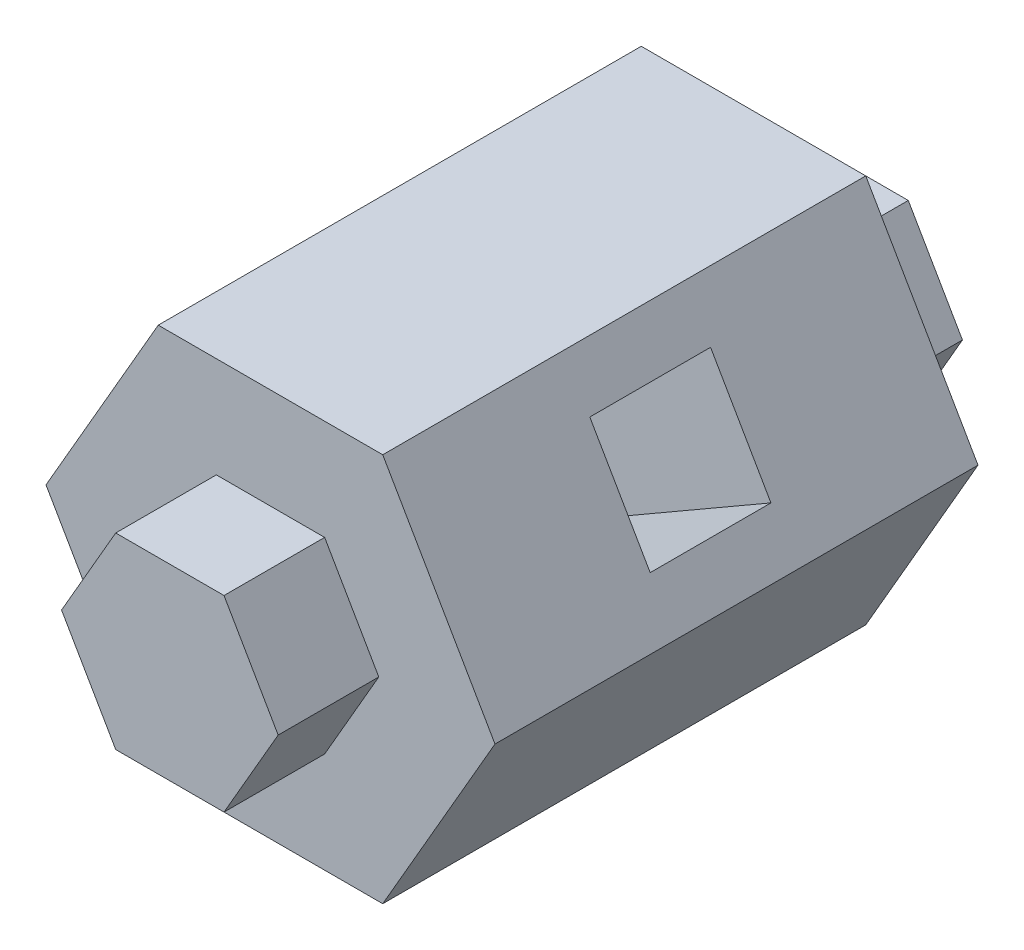
ISO-10303-21;
HEADER;
FILE_DESCRIPTION(('STEP AP214'),'2;1');
FILE_NAME('part.step','',(''),(''),'','','');
FILE_SCHEMA(('AUTOMOTIVE_DESIGN { 1 0 10303 214 1 1 1 1 }'));
ENDSEC;
DATA;
#1=APPLICATION_CONTEXT('core data for automotive mechanical design processes');
#2=APPLICATION_PROTOCOL_DEFINITION('international standard','automotive_design',2000,#1);
#3=PRODUCT_CONTEXT('',#1,'mechanical');
#4=PRODUCT('Part','Part','',(#3));
#5=PRODUCT_RELATED_PRODUCT_CATEGORY('part','',(#4));
#6=PRODUCT_DEFINITION_FORMATION('','',#4);
#7=PRODUCT_DEFINITION_CONTEXT('part definition',#1,'design');
#8=PRODUCT_DEFINITION('design','',#6,#7);
#9=PRODUCT_DEFINITION_SHAPE('','',#8);
#10=(LENGTH_UNIT() NAMED_UNIT(*) SI_UNIT(.MILLI.,.METRE.));
#11=(NAMED_UNIT(*) PLANE_ANGLE_UNIT() SI_UNIT($,.RADIAN.));
#12=(NAMED_UNIT(*) SI_UNIT($,.STERADIAN.) SOLID_ANGLE_UNIT());
#13=UNCERTAINTY_MEASURE_WITH_UNIT(LENGTH_MEASURE(1.E-05),#10,'distance_accuracy_value','');
#14=(GEOMETRIC_REPRESENTATION_CONTEXT(3) GLOBAL_UNCERTAINTY_ASSIGNED_CONTEXT((#13)) GLOBAL_UNIT_ASSIGNED_CONTEXT((#10,
#11,#12)) REPRESENTATION_CONTEXT('',''));
#15=CARTESIAN_POINT('',(0.,0.,0.));
#16=DIRECTION('',(0.,0.,1.));
#17=DIRECTION('',(1.,0.,0.));
#18=AXIS2_PLACEMENT_3D('',#15,#16,#17);
#19=CARTESIAN_POINT('',(5.57735026918962,9.66025403784438,-12.));
#20=DIRECTION('',(-0.866025403784439,-0.5,0.));
#21=DIRECTION('',(0.5,-0.866025403784439,0.));
#22=AXIS2_PLACEMENT_3D('',#19,#20,#21);
#23=PLANE('',#22);
#24=DIRECTION('',(0.,0.,1.));
#25=VECTOR('',#24,1.);
#26=CARTESIAN_POINT('',(6.86602540378443,7.42820323027551,-12.));
#27=LINE('',#26,#25);
#28=CARTESIAN_POINT('',(6.86602540378444,7.42820323027551,-15.));
#29=VERTEX_POINT('',#28);
#30=CARTESIAN_POINT('',(6.86602540378444,7.42820323027551,-9.));
#31=VERTEX_POINT('',#30);
#32=EDGE_CURVE('E201',#29,#31,#27,.T.);
#33=ORIENTED_EDGE('',*,*,#32,.F.);
#34=DIRECTION('',(0.5,-0.866025403784439,0.));
#35=VECTOR('',#34,1.);
#36=CARTESIAN_POINT('',(5.57735026918962,9.66025403784438,-15.));
#37=LINE('',#36,#35);
#38=CARTESIAN_POINT('',(9.86602540378443,2.23205080756888,-15.));
#39=VERTEX_POINT('',#38);
#40=EDGE_CURVE('E195',#29,#39,#37,.T.);
#41=ORIENTED_EDGE('',*,*,#40,.T.);
#42=DIRECTION('',(0.,0.,-1.));
#43=VECTOR('',#42,1.);
#44=CARTESIAN_POINT('',(9.86602540378443,2.23205080756888,-12.));
#45=LINE('',#44,#43);
#46=CARTESIAN_POINT('',(9.86602540378443,2.23205080756888,-9.));
#47=VERTEX_POINT('',#46);
#48=EDGE_CURVE('E178',#47,#39,#45,.T.);
#49=ORIENTED_EDGE('',*,*,#48,.F.);
#50=DIRECTION('',(0.5,-0.866025403784439,0.));
#51=VECTOR('',#50,1.);
#52=CARTESIAN_POINT('',(5.57735026918962,9.66025403784438,-9.));
#53=LINE('',#52,#51);
#54=EDGE_CURVE('E284',#31,#47,#53,.T.);
#55=ORIENTED_EDGE('',*,*,#54,.F.);
#56=EDGE_LOOP('',(#33,#41,#49,#55));
#57=FACE_BOUND('',#56,.T.);
#58=DIRECTION('',(0.5,-0.866025403784439,0.));
#59=VECTOR('',#58,1.);
#60=CARTESIAN_POINT('',(5.57735026918962,9.66025403784438,-24.));
#61=LINE('',#60,#59);
#62=CARTESIAN_POINT('',(5.57735026918962,9.66025403784438,-24.));
#63=VERTEX_POINT('',#62);
#64=CARTESIAN_POINT('',(11.1547005383792,0.,-24.));
#65=VERTEX_POINT('',#64);
#66=EDGE_CURVE('E212',#63,#65,#61,.T.);
#67=ORIENTED_EDGE('',*,*,#66,.F.);
#68=DIRECTION('',(0.,0.,1.));
#69=VECTOR('',#68,1.);
#70=CARTESIAN_POINT('',(5.57735026918962,9.66025403784438,-12.));
#71=LINE('',#70,#69);
#72=CARTESIAN_POINT('',(5.57735026918962,9.66025403784438,0.));
#73=VERTEX_POINT('',#72);
#74=EDGE_CURVE('E311',#63,#73,#71,.T.);
#75=ORIENTED_EDGE('',*,*,#74,.T.);
#76=DIRECTION('',(0.5,-0.866025403784439,0.));
#77=VECTOR('',#76,1.);
#78=CARTESIAN_POINT('',(5.57735026918962,9.66025403784438,0.));
#79=LINE('',#78,#77);
#80=CARTESIAN_POINT('',(11.1547005383792,0.,0.));
#81=VERTEX_POINT('',#80);
#82=EDGE_CURVE('E291',#73,#81,#79,.T.);
#83=ORIENTED_EDGE('',*,*,#82,.T.);
#84=DIRECTION('',(0.,0.,1.));
#85=VECTOR('',#84,1.);
#86=CARTESIAN_POINT('',(11.1547005383792,0.,-12.));
#87=LINE('',#86,#85);
#88=EDGE_CURVE('E308',#65,#81,#87,.T.);
#89=ORIENTED_EDGE('',*,*,#88,.F.);
#90=EDGE_LOOP('',(#67,#75,#83,#89));
#91=FACE_BOUND('',#90,.T.);
#92=ADVANCED_FACE('F33',(#57,#91),#23,.F.);
#93=CARTESIAN_POINT('',(-5.57735026918963,-9.66025403784438,-12.));
#94=DIRECTION('',(0.866025403784439,0.5,0.));
#95=DIRECTION('',(-0.5,0.866025403784439,0.));
#96=AXIS2_PLACEMENT_3D('',#93,#94,#95);
#97=PLANE('',#96);
#98=DIRECTION('',(0.,0.,1.));
#99=VECTOR('',#98,1.);
#100=CARTESIAN_POINT('',(-11.1547005383792,0.,-12.));
#101=LINE('',#100,#99);
#102=CARTESIAN_POINT('',(-11.1547005383792,0.,-24.));
#103=VERTEX_POINT('',#102);
#104=CARTESIAN_POINT('',(-11.1547005383792,0.,0.));
#105=VERTEX_POINT('',#104);
#106=EDGE_CURVE('E299',#103,#105,#101,.T.);
#107=ORIENTED_EDGE('',*,*,#106,.F.);
#108=DIRECTION('',(-0.5,0.866025403784439,0.));
#109=VECTOR('',#108,1.);
#110=CARTESIAN_POINT('',(-5.57735026918963,-9.66025403784438,-24.));
#111=LINE('',#110,#109);
#112=CARTESIAN_POINT('',(-5.57735026918963,-9.66025403784438,-24.));
#113=VERTEX_POINT('',#112);
#114=EDGE_CURVE('E221',#113,#103,#111,.T.);
#115=ORIENTED_EDGE('',*,*,#114,.F.);
#116=DIRECTION('',(0.,0.,1.));
#117=VECTOR('',#116,1.);
#118=CARTESIAN_POINT('',(-5.57735026918963,-9.66025403784438,-12.));
#119=LINE('',#118,#117);
#120=CARTESIAN_POINT('',(-5.57735026918963,-9.66025403784438,0.));
#121=VERTEX_POINT('',#120);
#122=EDGE_CURVE('E302',#113,#121,#119,.T.);
#123=ORIENTED_EDGE('',*,*,#122,.T.);
#124=DIRECTION('',(-0.5,0.866025403784439,0.));
#125=VECTOR('',#124,1.);
#126=CARTESIAN_POINT('',(-5.57735026918963,-9.66025403784438,0.));
#127=LINE('',#126,#125);
#128=EDGE_CURVE('E297',#121,#105,#127,.T.);
#129=ORIENTED_EDGE('',*,*,#128,.T.);
#130=EDGE_LOOP('',(#107,#115,#123,#129));
#131=FACE_BOUND('',#130,.T.);
#132=DIRECTION('',(0.,0.,-1.));
#133=VECTOR('',#132,1.);
#134=CARTESIAN_POINT('',(-9.86602540378444,-2.23205080756887,-12.));
#135=LINE('',#134,#133);
#136=CARTESIAN_POINT('',(-9.86602540378444,-2.23205080756887,-9.));
#137=VERTEX_POINT('',#136);
#138=CARTESIAN_POINT('',(-9.86602540378444,-2.23205080756887,-15.));
#139=VERTEX_POINT('',#138);
#140=EDGE_CURVE('E188',#137,#139,#135,.T.);
#141=ORIENTED_EDGE('',*,*,#140,.F.);
#142=DIRECTION('',(-0.5,0.866025403784439,0.));
#143=VECTOR('',#142,1.);
#144=CARTESIAN_POINT('',(-5.57735026918963,-9.66025403784438,-9.));
#145=LINE('',#144,#143);
#146=CARTESIAN_POINT('',(-6.86602540378444,-7.4282032302755,-9.));
#147=VERTEX_POINT('',#146);
#148=EDGE_CURVE('E11',#147,#137,#145,.T.);
#149=ORIENTED_EDGE('',*,*,#148,.F.);
#150=DIRECTION('',(0.,0.,1.));
#151=VECTOR('',#150,1.);
#152=CARTESIAN_POINT('',(-6.86602540378444,-7.4282032302755,-12.));
#153=LINE('',#152,#151);
#154=CARTESIAN_POINT('',(-6.86602540378444,-7.4282032302755,-15.));
#155=VERTEX_POINT('',#154);
#156=EDGE_CURVE('E189',#155,#147,#153,.T.);
#157=ORIENTED_EDGE('',*,*,#156,.F.);
#158=DIRECTION('',(-0.5,0.866025403784439,0.));
#159=VECTOR('',#158,1.);
#160=CARTESIAN_POINT('',(-5.57735026918963,-9.66025403784438,-15.));
#161=LINE('',#160,#159);
#162=EDGE_CURVE('E197',#155,#139,#161,.T.);
#163=ORIENTED_EDGE('',*,*,#162,.T.);
#164=EDGE_LOOP('',(#141,#149,#157,#163));
#165=FACE_BOUND('',#164,.T.);
#166=ADVANCED_FACE('F397',(#131,#165),#97,.F.);
#167=CARTESIAN_POINT('',(5.38119784648299,0.,5.));
#168=DIRECTION('',(-0.866025403784439,-0.5,0.));
#169=DIRECTION('',(0.5,-0.866025403784439,0.));
#170=AXIS2_PLACEMENT_3D('',#167,#168,#169);
#171=PLANE('',#170);
#172=DIRECTION('',(-0.5,0.866025403784438,0.));
#173=VECTOR('',#172,1.);
#174=CARTESIAN_POINT('',(5.38119784648299,0.,0.));
#175=LINE('',#174,#173);
#176=CARTESIAN_POINT('',(5.38119784648299,0.,0.));
#177=VERTEX_POINT('',#176);
#178=CARTESIAN_POINT('',(2.69059892324149,4.66025403784439,0.));
#179=VERTEX_POINT('',#178);
#180=EDGE_CURVE('E317',#177,#179,#175,.T.);
#181=ORIENTED_EDGE('',*,*,#180,.T.);
#182=DIRECTION('',(0.,0.,-1.));
#183=VECTOR('',#182,1.);
#184=CARTESIAN_POINT('',(2.69059892324149,4.66025403784439,5.));
#185=LINE('',#184,#183);
#186=CARTESIAN_POINT('',(2.69059892324149,4.66025403784439,5.));
#187=VERTEX_POINT('',#186);
#188=EDGE_CURVE('E42',#187,#179,#185,.T.);
#189=ORIENTED_EDGE('',*,*,#188,.F.);
#190=DIRECTION('',(-0.5,0.866025403784438,0.));
#191=VECTOR('',#190,1.);
#192=CARTESIAN_POINT('',(5.38119784648299,0.,5.));
#193=LINE('',#192,#191);
#194=CARTESIAN_POINT('',(5.38119784648299,0.,5.));
#195=VERTEX_POINT('',#194);
#196=EDGE_CURVE('E318',#195,#187,#193,.T.);
#197=ORIENTED_EDGE('',*,*,#196,.F.);
#198=DIRECTION('',(0.,0.,-1.));
#199=VECTOR('',#198,1.);
#200=CARTESIAN_POINT('',(5.38119784648299,0.,5.));
#201=LINE('',#200,#199);
#202=EDGE_CURVE('E330',#195,#177,#201,.T.);
#203=ORIENTED_EDGE('',*,*,#202,.T.);
#204=EDGE_LOOP('',(#181,#189,#197,#203));
#205=FACE_BOUND('',#204,.T.);
#206=ADVANCED_FACE('F35',(#205),#171,.F.);
#207=CARTESIAN_POINT('',(2.69059892324149,4.66025403784439,5.));
#208=DIRECTION('',(0.,-1.,0.));
#209=DIRECTION('',(1.,0.,0.));
#210=AXIS2_PLACEMENT_3D('',#207,#208,#209);
#211=PLANE('',#210);
#212=DIRECTION('',(-1.,0.,0.));
#213=VECTOR('',#212,1.);
#214=CARTESIAN_POINT('',(2.69059892324149,4.66025403784439,0.));
#215=LINE('',#214,#213);
#216=CARTESIAN_POINT('',(-2.69059892324149,4.66025403784439,0.));
#217=VERTEX_POINT('',#216);
#218=EDGE_CURVE('E333',#179,#217,#215,.T.);
#219=ORIENTED_EDGE('',*,*,#218,.T.);
#220=DIRECTION('',(0.,0.,-1.));
#221=VECTOR('',#220,1.);
#222=CARTESIAN_POINT('',(-2.69059892324149,4.66025403784439,5.));
#223=LINE('',#222,#221);
#224=CARTESIAN_POINT('',(-2.69059892324149,4.66025403784439,5.));
#225=VERTEX_POINT('',#224);
#226=EDGE_CURVE('E358',#225,#217,#223,.T.);
#227=ORIENTED_EDGE('',*,*,#226,.F.);
#228=DIRECTION('',(-1.,0.,0.));
#229=VECTOR('',#228,1.);
#230=CARTESIAN_POINT('',(2.69059892324149,4.66025403784439,5.));
#231=LINE('',#230,#229);
#232=EDGE_CURVE('E320',#187,#225,#231,.T.);
#233=ORIENTED_EDGE('',*,*,#232,.F.);
#234=ORIENTED_EDGE('',*,*,#188,.T.);
#235=EDGE_LOOP('',(#219,#227,#233,#234));
#236=FACE_BOUND('',#235,.T.);
#237=ADVANCED_FACE('F363',(#236),#211,.F.);
#238=CARTESIAN_POINT('',(-2.69059892324149,4.66025403784439,5.));
#239=DIRECTION('',(0.866025403784439,-0.5,0.));
#240=DIRECTION('',(0.5,0.866025403784439,0.));
#241=AXIS2_PLACEMENT_3D('',#238,#239,#240);
#242=PLANE('',#241);
#243=DIRECTION('',(-0.499999999999999,-0.866025403784439,0.));
#244=VECTOR('',#243,1.);
#245=CARTESIAN_POINT('',(-2.69059892324149,4.66025403784439,0.));
#246=LINE('',#245,#244);
#247=CARTESIAN_POINT('',(-5.38119784648299,0.,0.));
#248=VERTEX_POINT('',#247);
#249=EDGE_CURVE('E336',#217,#248,#246,.T.);
#250=ORIENTED_EDGE('',*,*,#249,.T.);
#251=DIRECTION('',(0.,0.,-1.));
#252=VECTOR('',#251,1.);
#253=CARTESIAN_POINT('',(-5.38119784648299,0.,5.));
#254=LINE('',#253,#252);
#255=CARTESIAN_POINT('',(-5.38119784648299,0.,5.));
#256=VERTEX_POINT('',#255);
#257=EDGE_CURVE('E355',#256,#248,#254,.T.);
#258=ORIENTED_EDGE('',*,*,#257,.F.);
#259=DIRECTION('',(-0.499999999999999,-0.866025403784439,0.));
#260=VECTOR('',#259,1.);
#261=CARTESIAN_POINT('',(-2.69059892324149,4.66025403784439,5.));
#262=LINE('',#261,#260);
#263=EDGE_CURVE('E323',#225,#256,#262,.T.);
#264=ORIENTED_EDGE('',*,*,#263,.F.);
#265=ORIENTED_EDGE('',*,*,#226,.T.);
#266=EDGE_LOOP('',(#250,#258,#264,#265));
#267=FACE_BOUND('',#266,.T.);
#268=ADVANCED_FACE('F383',(#267),#242,.F.);
#269=CARTESIAN_POINT('',(-5.38119784648299,0.,5.));
#270=DIRECTION('',(0.866025403784438,0.5,0.));
#271=DIRECTION('',(-0.5,0.866025403784438,0.));
#272=AXIS2_PLACEMENT_3D('',#269,#270,#271);
#273=PLANE('',#272);
#274=DIRECTION('',(0.5,-0.866025403784438,0.));
#275=VECTOR('',#274,1.);
#276=CARTESIAN_POINT('',(-5.38119784648299,0.,0.));
#277=LINE('',#276,#275);
#278=CARTESIAN_POINT('',(-2.69059892324149,-4.66025403784439,0.));
#279=VERTEX_POINT('',#278);
#280=EDGE_CURVE('E339',#248,#279,#277,.T.);
#281=ORIENTED_EDGE('',*,*,#280,.T.);
#282=DIRECTION('',(0.,0.,-1.));
#283=VECTOR('',#282,1.);
#284=CARTESIAN_POINT('',(-2.69059892324149,-4.66025403784439,5.));
#285=LINE('',#284,#283);
#286=CARTESIAN_POINT('',(-2.69059892324149,-4.66025403784439,5.));
#287=VERTEX_POINT('',#286);
#288=EDGE_CURVE('E352',#287,#279,#285,.T.);
#289=ORIENTED_EDGE('',*,*,#288,.F.);
#290=DIRECTION('',(0.5,-0.866025403784438,0.));
#291=VECTOR('',#290,1.);
#292=CARTESIAN_POINT('',(-5.38119784648299,0.,5.));
#293=LINE('',#292,#291);
#294=EDGE_CURVE('E325',#256,#287,#293,.T.);
#295=ORIENTED_EDGE('',*,*,#294,.F.);
#296=ORIENTED_EDGE('',*,*,#257,.T.);
#297=EDGE_LOOP('',(#281,#289,#295,#296));
#298=FACE_BOUND('',#297,.T.);
#299=ADVANCED_FACE('F378',(#298),#273,.F.);
#300=CARTESIAN_POINT('',(-2.69059892324149,-4.66025403784439,5.));
#301=DIRECTION('',(0.,1.,0.));
#302=DIRECTION('',(0.,0.,1.));
#303=AXIS2_PLACEMENT_3D('',#300,#301,#302);
#304=PLANE('',#303);
#305=DIRECTION('',(1.,0.,0.));
#306=VECTOR('',#305,1.);
#307=CARTESIAN_POINT('',(-2.69059892324149,-4.66025403784439,0.));
#308=LINE('',#307,#306);
#309=CARTESIAN_POINT('',(2.6905989232415,-4.66025403784439,0.));
#310=VERTEX_POINT('',#309);
#311=EDGE_CURVE('E342',#279,#310,#308,.T.);
#312=ORIENTED_EDGE('',*,*,#311,.T.);
#313=DIRECTION('',(0.,0.,-1.));
#314=VECTOR('',#313,1.);
#315=CARTESIAN_POINT('',(2.6905989232415,-4.66025403784439,5.));
#316=LINE('',#315,#314);
#317=CARTESIAN_POINT('',(2.6905989232415,-4.66025403784439,5.));
#318=VERTEX_POINT('',#317);
#319=EDGE_CURVE('E349',#318,#310,#316,.T.);
#320=ORIENTED_EDGE('',*,*,#319,.F.);
#321=DIRECTION('',(1.,0.,0.));
#322=VECTOR('',#321,1.);
#323=CARTESIAN_POINT('',(-2.69059892324149,-4.66025403784439,5.));
#324=LINE('',#323,#322);
#325=EDGE_CURVE('E327',#287,#318,#324,.T.);
#326=ORIENTED_EDGE('',*,*,#325,.F.);
#327=ORIENTED_EDGE('',*,*,#288,.T.);
#328=EDGE_LOOP('',(#312,#320,#326,#327));
#329=FACE_BOUND('',#328,.T.);
#330=ADVANCED_FACE('F375',(#329),#304,.F.);
#331=CARTESIAN_POINT('',(2.6905989232415,-4.66025403784439,5.));
#332=DIRECTION('',(-0.866025403784439,0.499999999999999,0.));
#333=DIRECTION('',(-0.499999999999999,-0.866025403784439,0.));
#334=AXIS2_PLACEMENT_3D('',#331,#332,#333);
#335=PLANE('',#334);
#336=DIRECTION('',(0.499999999999999,0.866025403784439,0.));
#337=VECTOR('',#336,1.);
#338=CARTESIAN_POINT('',(2.6905989232415,-4.66025403784439,0.));
#339=LINE('',#338,#337);
#340=EDGE_CURVE('E321',#310,#177,#339,.T.);
#341=ORIENTED_EDGE('',*,*,#340,.T.);
#342=ORIENTED_EDGE('',*,*,#202,.F.);
#343=DIRECTION('',(0.499999999999999,0.866025403784439,0.));
#344=VECTOR('',#343,1.);
#345=CARTESIAN_POINT('',(2.6905989232415,-4.66025403784439,5.));
#346=LINE('',#345,#344);
#347=EDGE_CURVE('E49',#318,#195,#346,.T.);
#348=ORIENTED_EDGE('',*,*,#347,.F.);
#349=ORIENTED_EDGE('',*,*,#319,.T.);
#350=EDGE_LOOP('',(#341,#342,#348,#349));
#351=FACE_BOUND('',#350,.T.);
#352=ADVANCED_FACE('F371',(#351),#335,.F.);
#353=CARTESIAN_POINT('',(0.,0.,5.));
#354=DIRECTION('',(0.,0.,1.));
#355=DIRECTION('',(1.,0.,0.));
#356=AXIS2_PLACEMENT_3D('',#353,#354,#355);
#357=PLANE('',#356);
#358=ORIENTED_EDGE('',*,*,#196,.T.);
#359=ORIENTED_EDGE('',*,*,#232,.T.);
#360=ORIENTED_EDGE('',*,*,#263,.T.);
#361=ORIENTED_EDGE('',*,*,#294,.T.);
#362=ORIENTED_EDGE('',*,*,#325,.T.);
#363=ORIENTED_EDGE('',*,*,#347,.T.);
#364=EDGE_LOOP('',(#358,#359,#360,#361,#362,#363));
#365=FACE_BOUND('',#364,.T.);
#366=ADVANCED_FACE('F384',(#365),#357,.T.);
#367=CARTESIAN_POINT('',(0.,0.,0.));
#368=DIRECTION('',(0.,0.,-1.));
#369=DIRECTION('',(-1.,0.,0.));
#370=AXIS2_PLACEMENT_3D('',#367,#368,#369);
#371=PLANE('',#370);
#372=DIRECTION('',(0.500000000000001,0.866025403784438,0.));
#373=VECTOR('',#372,1.);
#374=CARTESIAN_POINT('',(-11.1547005383792,0.,0.));
#375=LINE('',#374,#373);
#376=CARTESIAN_POINT('',(-5.57735026918962,9.66025403784438,0.));
#377=VERTEX_POINT('',#376);
#378=EDGE_CURVE('E286',#105,#377,#375,.T.);
#379=ORIENTED_EDGE('',*,*,#378,.F.);
#380=ORIENTED_EDGE('',*,*,#128,.F.);
#381=DIRECTION('',(-1.,0.,0.));
#382=VECTOR('',#381,1.);
#383=CARTESIAN_POINT('',(5.57735026918962,-9.66025403784438,0.));
#384=LINE('',#383,#382);
#385=CARTESIAN_POINT('',(5.57735026918962,-9.66025403784438,0.));
#386=VERTEX_POINT('',#385);
#387=EDGE_CURVE('E295',#386,#121,#384,.T.);
#388=ORIENTED_EDGE('',*,*,#387,.F.);
#389=DIRECTION('',(-0.5,-0.866025403784438,0.));
#390=VECTOR('',#389,1.);
#391=CARTESIAN_POINT('',(11.1547005383792,0.,0.));
#392=LINE('',#391,#390);
#393=EDGE_CURVE('E293',#81,#386,#392,.T.);
#394=ORIENTED_EDGE('',*,*,#393,.F.);
#395=ORIENTED_EDGE('',*,*,#82,.F.);
#396=DIRECTION('',(1.,0.,0.));
#397=VECTOR('',#396,1.);
#398=CARTESIAN_POINT('',(-5.57735026918962,9.66025403784438,0.));
#399=LINE('',#398,#397);
#400=EDGE_CURVE('E289',#377,#73,#399,.T.);
#401=ORIENTED_EDGE('',*,*,#400,.F.);
#402=EDGE_LOOP('',(#379,#380,#388,#394,#395,#401));
#403=FACE_BOUND('',#402,.T.);
#404=ORIENTED_EDGE('',*,*,#218,.F.);
#405=ORIENTED_EDGE('',*,*,#180,.F.);
#406=ORIENTED_EDGE('',*,*,#340,.F.);
#407=ORIENTED_EDGE('',*,*,#311,.F.);
#408=ORIENTED_EDGE('',*,*,#280,.F.);
#409=ORIENTED_EDGE('',*,*,#249,.F.);
#410=EDGE_LOOP('',(#404,#405,#406,#407,#408,#409));
#411=FACE_BOUND('',#410,.T.);
#412=ADVANCED_FACE('F369',(#403,#411),#371,.F.);
#413=CARTESIAN_POINT('',(-11.1547005383792,0.,-12.));
#414=DIRECTION('',(0.866025403784438,-0.5,0.));
#415=DIRECTION('',(0.500000000000001,0.866025403784438,0.));
#416=AXIS2_PLACEMENT_3D('',#413,#414,#415);
#417=PLANE('',#416);
#418=ORIENTED_EDGE('',*,*,#378,.T.);
#419=DIRECTION('',(0.,0.,1.));
#420=VECTOR('',#419,1.);
#421=CARTESIAN_POINT('',(-5.57735026918962,9.66025403784438,-12.));
#422=LINE('',#421,#420);
#423=CARTESIAN_POINT('',(-5.57735026918962,9.66025403784438,-24.));
#424=VERTEX_POINT('',#423);
#425=EDGE_CURVE('E314',#424,#377,#422,.T.);
#426=ORIENTED_EDGE('',*,*,#425,.F.);
#427=DIRECTION('',(0.500000000000001,0.866025403784438,0.));
#428=VECTOR('',#427,1.);
#429=CARTESIAN_POINT('',(-11.1547005383792,0.,-24.));
#430=LINE('',#429,#428);
#431=EDGE_CURVE('E203',#103,#424,#430,.T.);
#432=ORIENTED_EDGE('',*,*,#431,.F.);
#433=ORIENTED_EDGE('',*,*,#106,.T.);
#434=EDGE_LOOP('',(#418,#426,#432,#433));
#435=FACE_BOUND('',#434,.T.);
#436=ADVANCED_FACE('F391',(#435),#417,.F.);
#437=CARTESIAN_POINT('',(-5.57735026918962,9.66025403784438,-12.));
#438=DIRECTION('',(0.,-1.,0.));
#439=DIRECTION('',(0.,0.,-1.));
#440=AXIS2_PLACEMENT_3D('',#437,#438,#439);
#441=PLANE('',#440);
#442=ORIENTED_EDGE('',*,*,#400,.T.);
#443=ORIENTED_EDGE('',*,*,#74,.F.);
#444=DIRECTION('',(1.,0.,0.));
#445=VECTOR('',#444,1.);
#446=CARTESIAN_POINT('',(-5.57735026918962,9.66025403784438,-24.));
#447=LINE('',#446,#445);
#448=EDGE_CURVE('E206',#424,#63,#447,.T.);
#449=ORIENTED_EDGE('',*,*,#448,.F.);
#450=ORIENTED_EDGE('',*,*,#425,.T.);
#451=EDGE_LOOP('',(#442,#443,#449,#450));
#452=FACE_BOUND('',#451,.T.);
#453=ADVANCED_FACE('F408',(#452),#441,.F.);
#454=CARTESIAN_POINT('',(11.1547005383792,0.,-12.));
#455=DIRECTION('',(-0.866025403784438,0.5,0.));
#456=DIRECTION('',(-0.5,-0.866025403784438,0.));
#457=AXIS2_PLACEMENT_3D('',#454,#455,#456);
#458=PLANE('',#457);
#459=ORIENTED_EDGE('',*,*,#393,.T.);
#460=DIRECTION('',(0.,0.,1.));
#461=VECTOR('',#460,1.);
#462=CARTESIAN_POINT('',(5.57735026918962,-9.66025403784438,-12.));
#463=LINE('',#462,#461);
#464=CARTESIAN_POINT('',(5.57735026918962,-9.66025403784438,-24.));
#465=VERTEX_POINT('',#464);
#466=EDGE_CURVE('E305',#465,#386,#463,.T.);
#467=ORIENTED_EDGE('',*,*,#466,.F.);
#468=DIRECTION('',(-0.5,-0.866025403784438,0.));
#469=VECTOR('',#468,1.);
#470=CARTESIAN_POINT('',(11.1547005383792,0.,-24.));
#471=LINE('',#470,#469);
#472=EDGE_CURVE('E215',#65,#465,#471,.T.);
#473=ORIENTED_EDGE('',*,*,#472,.F.);
#474=ORIENTED_EDGE('',*,*,#88,.T.);
#475=EDGE_LOOP('',(#459,#467,#473,#474));
#476=FACE_BOUND('',#475,.T.);
#477=ADVANCED_FACE('F406',(#476),#458,.F.);
#478=CARTESIAN_POINT('',(5.57735026918962,-9.66025403784438,-12.));
#479=DIRECTION('',(0.,1.,0.));
#480=DIRECTION('',(-1.,0.,0.));
#481=AXIS2_PLACEMENT_3D('',#478,#479,#480);
#482=PLANE('',#481);
#483=ORIENTED_EDGE('',*,*,#387,.T.);
#484=ORIENTED_EDGE('',*,*,#122,.F.);
#485=DIRECTION('',(-1.,0.,0.));
#486=VECTOR('',#485,1.);
#487=CARTESIAN_POINT('',(5.57735026918962,-9.66025403784438,-24.));
#488=LINE('',#487,#486);
#489=EDGE_CURVE('E218',#465,#113,#488,.T.);
#490=ORIENTED_EDGE('',*,*,#489,.F.);
#491=ORIENTED_EDGE('',*,*,#466,.T.);
#492=EDGE_LOOP('',(#483,#484,#490,#491));
#493=FACE_BOUND('',#492,.T.);
#494=ADVANCED_FACE('F430',(#493),#482,.F.);
#495=CARTESIAN_POINT('',(14.0490381056766,4.64711431702997,-9.));
#496=DIRECTION('',(0.,0.,-1.));
#497=DIRECTION('',(0.,1.,0.));
#498=AXIS2_PLACEMENT_3D('',#495,#496,#497);
#499=PLANE('',#498);
#500=ORIENTED_EDGE('',*,*,#54,.T.);
#501=DIRECTION('',(-0.866025403784439,-0.5,0.));
#502=VECTOR('',#501,1.);
#503=CARTESIAN_POINT('',(14.0490381056766,4.64711431702997,-9.));
#504=LINE('',#503,#502);
#505=EDGE_CURVE('E184',#47,#147,#504,.T.);
#506=ORIENTED_EDGE('',*,*,#505,.T.);
#507=ORIENTED_EDGE('',*,*,#148,.T.);
#508=DIRECTION('',(-0.866025403784439,-0.5,0.));
#509=VECTOR('',#508,1.);
#510=CARTESIAN_POINT('',(11.0490381056766,9.8432667397366,-9.));
#511=LINE('',#510,#509);
#512=EDGE_CURVE('E278',#31,#137,#511,.T.);
#513=ORIENTED_EDGE('',*,*,#512,.F.);
#514=EDGE_LOOP('',(#500,#506,#507,#513));
#515=FACE_BOUND('',#514,.T.);
#516=ADVANCED_FACE('F437',(#515),#499,.T.);
#517=CARTESIAN_POINT('',(11.0490381056766,9.8432667397366,-12.));
#518=DIRECTION('',(0.5,-0.866025403784439,0.));
#519=DIRECTION('',(0.866025403784439,0.5,0.));
#520=AXIS2_PLACEMENT_3D('',#517,#518,#519);
#521=PLANE('',#520);
#522=ORIENTED_EDGE('',*,*,#32,.T.);
#523=ORIENTED_EDGE('',*,*,#512,.T.);
#524=ORIENTED_EDGE('',*,*,#140,.T.);
#525=DIRECTION('',(-0.866025403784439,-0.5,0.));
#526=VECTOR('',#525,1.);
#527=CARTESIAN_POINT('',(11.0490381056766,9.8432667397366,-15.));
#528=LINE('',#527,#526);
#529=EDGE_CURVE('E198',#29,#139,#528,.T.);
#530=ORIENTED_EDGE('',*,*,#529,.F.);
#531=EDGE_LOOP('',(#522,#523,#524,#530));
#532=FACE_BOUND('',#531,.T.);
#533=ADVANCED_FACE('F441',(#532),#521,.T.);
#534=CARTESIAN_POINT('',(14.0490381056766,4.64711431702997,-12.));
#535=DIRECTION('',(-0.5,0.866025403784439,0.));
#536=DIRECTION('',(-0.866025403784439,-0.5,0.));
#537=AXIS2_PLACEMENT_3D('',#534,#535,#536);
#538=PLANE('',#537);
#539=ORIENTED_EDGE('',*,*,#48,.T.);
#540=DIRECTION('',(-0.866025403784439,-0.5,0.));
#541=VECTOR('',#540,1.);
#542=CARTESIAN_POINT('',(14.0490381056766,4.64711431702997,-15.));
#543=LINE('',#542,#541);
#544=EDGE_CURVE('E181',#39,#155,#543,.T.);
#545=ORIENTED_EDGE('',*,*,#544,.T.);
#546=ORIENTED_EDGE('',*,*,#156,.T.);
#547=ORIENTED_EDGE('',*,*,#505,.F.);
#548=EDGE_LOOP('',(#539,#545,#546,#547));
#549=FACE_BOUND('',#548,.T.);
#550=ADVANCED_FACE('F180',(#549),#538,.T.);
#551=CARTESIAN_POINT('',(5.38119784648299,0.,-29.));
#552=DIRECTION('',(-0.866025403784439,-0.5,0.));
#553=DIRECTION('',(0.5,-0.866025403784439,0.));
#554=AXIS2_PLACEMENT_3D('',#551,#552,#553);
#555=PLANE('',#554);
#556=DIRECTION('',(-0.5,0.866025403784438,0.));
#557=VECTOR('',#556,1.);
#558=CARTESIAN_POINT('',(5.38119784648299,0.,-24.));
#559=LINE('',#558,#557);
#560=CARTESIAN_POINT('',(5.38119784648299,0.,-24.));
#561=VERTEX_POINT('',#560);
#562=CARTESIAN_POINT('',(2.69059892324149,4.66025403784439,-24.));
#563=VERTEX_POINT('',#562);
#564=EDGE_CURVE('E224',#561,#563,#559,.T.);
#565=ORIENTED_EDGE('',*,*,#564,.F.);
#566=DIRECTION('',(0.,0.,1.));
#567=VECTOR('',#566,1.);
#568=CARTESIAN_POINT('',(5.38119784648299,0.,-29.));
#569=LINE('',#568,#567);
#570=CARTESIAN_POINT('',(5.38119784648299,0.,-29.));
#571=VERTEX_POINT('',#570);
#572=EDGE_CURVE('E243',#571,#561,#569,.T.);
#573=ORIENTED_EDGE('',*,*,#572,.F.);
#574=DIRECTION('',(-0.5,0.866025403784438,0.));
#575=VECTOR('',#574,1.);
#576=CARTESIAN_POINT('',(5.38119784648299,0.,-29.));
#577=LINE('',#576,#575);
#578=CARTESIAN_POINT('',(2.69059892324149,4.66025403784439,-29.));
#579=VERTEX_POINT('',#578);
#580=EDGE_CURVE('E225',#571,#579,#577,.T.);
#581=ORIENTED_EDGE('',*,*,#580,.T.);
#582=DIRECTION('',(0.,0.,1.));
#583=VECTOR('',#582,1.);
#584=CARTESIAN_POINT('',(2.69059892324149,4.66025403784439,-29.));
#585=LINE('',#584,#583);
#586=EDGE_CURVE('E273',#579,#563,#585,.T.);
#587=ORIENTED_EDGE('',*,*,#586,.T.);
#588=EDGE_LOOP('',(#565,#573,#581,#587));
#589=FACE_BOUND('',#588,.T.);
#590=ADVANCED_FACE('F450',(#589),#555,.F.);
#591=CARTESIAN_POINT('',(2.69059892324149,4.66025403784439,-29.));
#592=DIRECTION('',(0.,-1.,0.));
#593=DIRECTION('',(1.,0.,0.));
#594=AXIS2_PLACEMENT_3D('',#591,#592,#593);
#595=PLANE('',#594);
#596=DIRECTION('',(-1.,0.,0.));
#597=VECTOR('',#596,1.);
#598=CARTESIAN_POINT('',(2.69059892324149,4.66025403784439,-24.));
#599=LINE('',#598,#597);
#600=CARTESIAN_POINT('',(-2.69059892324149,4.66025403784439,-24.));
#601=VERTEX_POINT('',#600);
#602=EDGE_CURVE('E246',#563,#601,#599,.T.);
#603=ORIENTED_EDGE('',*,*,#602,.F.);
#604=ORIENTED_EDGE('',*,*,#586,.F.);
#605=DIRECTION('',(-1.,0.,0.));
#606=VECTOR('',#605,1.);
#607=CARTESIAN_POINT('',(2.69059892324149,4.66025403784439,-29.));
#608=LINE('',#607,#606);
#609=CARTESIAN_POINT('',(-2.69059892324149,4.66025403784439,-29.));
#610=VERTEX_POINT('',#609);
#611=EDGE_CURVE('E228',#579,#610,#608,.T.);
#612=ORIENTED_EDGE('',*,*,#611,.T.);
#613=DIRECTION('',(0.,0.,1.));
#614=VECTOR('',#613,1.);
#615=CARTESIAN_POINT('',(-2.69059892324149,4.66025403784439,-29.));
#616=LINE('',#615,#614);
#617=EDGE_CURVE('E270',#610,#601,#616,.T.);
#618=ORIENTED_EDGE('',*,*,#617,.T.);
#619=EDGE_LOOP('',(#603,#604,#612,#618));
#620=FACE_BOUND('',#619,.T.);
#621=ADVANCED_FACE('F453',(#620),#595,.F.);
#622=CARTESIAN_POINT('',(-2.69059892324149,4.66025403784439,-29.));
#623=DIRECTION('',(0.866025403784439,-0.5,0.));
#624=DIRECTION('',(0.5,0.866025403784439,0.));
#625=AXIS2_PLACEMENT_3D('',#622,#623,#624);
#626=PLANE('',#625);
#627=DIRECTION('',(-0.499999999999999,-0.866025403784439,0.));
#628=VECTOR('',#627,1.);
#629=CARTESIAN_POINT('',(-2.69059892324149,4.66025403784439,-24.));
#630=LINE('',#629,#628);
#631=CARTESIAN_POINT('',(-5.38119784648299,0.,-24.));
#632=VERTEX_POINT('',#631);
#633=EDGE_CURVE('E249',#601,#632,#630,.T.);
#634=ORIENTED_EDGE('',*,*,#633,.F.);
#635=ORIENTED_EDGE('',*,*,#617,.F.);
#636=DIRECTION('',(-0.499999999999999,-0.866025403784439,0.));
#637=VECTOR('',#636,1.);
#638=CARTESIAN_POINT('',(-2.69059892324149,4.66025403784439,-29.));
#639=LINE('',#638,#637);
#640=CARTESIAN_POINT('',(-5.38119784648299,0.,-29.));
#641=VERTEX_POINT('',#640);
#642=EDGE_CURVE('E232',#610,#641,#639,.T.);
#643=ORIENTED_EDGE('',*,*,#642,.T.);
#644=DIRECTION('',(0.,0.,1.));
#645=VECTOR('',#644,1.);
#646=CARTESIAN_POINT('',(-5.38119784648299,0.,-29.));
#647=LINE('',#646,#645);
#648=EDGE_CURVE('E267',#641,#632,#647,.T.);
#649=ORIENTED_EDGE('',*,*,#648,.T.);
#650=EDGE_LOOP('',(#634,#635,#643,#649));
#651=FACE_BOUND('',#650,.T.);
#652=ADVANCED_FACE('F457',(#651),#626,.F.);
#653=CARTESIAN_POINT('',(-5.38119784648299,0.,-29.));
#654=DIRECTION('',(0.866025403784438,0.5,0.));
#655=DIRECTION('',(-0.5,0.866025403784438,0.));
#656=AXIS2_PLACEMENT_3D('',#653,#654,#655);
#657=PLANE('',#656);
#658=DIRECTION('',(0.5,-0.866025403784438,0.));
#659=VECTOR('',#658,1.);
#660=CARTESIAN_POINT('',(-5.38119784648299,0.,-24.));
#661=LINE('',#660,#659);
#662=CARTESIAN_POINT('',(-2.69059892324149,-4.66025403784439,-24.));
#663=VERTEX_POINT('',#662);
#664=EDGE_CURVE('E252',#632,#663,#661,.T.);
#665=ORIENTED_EDGE('',*,*,#664,.F.);
#666=ORIENTED_EDGE('',*,*,#648,.F.);
#667=DIRECTION('',(0.5,-0.866025403784438,0.));
#668=VECTOR('',#667,1.);
#669=CARTESIAN_POINT('',(-5.38119784648299,0.,-29.));
#670=LINE('',#669,#668);
#671=CARTESIAN_POINT('',(-2.69059892324149,-4.66025403784439,-29.));
#672=VERTEX_POINT('',#671);
#673=EDGE_CURVE('E235',#641,#672,#670,.T.);
#674=ORIENTED_EDGE('',*,*,#673,.T.);
#675=DIRECTION('',(0.,0.,1.));
#676=VECTOR('',#675,1.);
#677=CARTESIAN_POINT('',(-2.69059892324149,-4.66025403784439,-29.));
#678=LINE('',#677,#676);
#679=EDGE_CURVE('E264',#672,#663,#678,.T.);
#680=ORIENTED_EDGE('',*,*,#679,.T.);
#681=EDGE_LOOP('',(#665,#666,#674,#680));
#682=FACE_BOUND('',#681,.T.);
#683=ADVANCED_FACE('F461',(#682),#657,.F.);
#684=CARTESIAN_POINT('',(-2.69059892324149,-4.66025403784439,-29.));
#685=DIRECTION('',(0.,1.,0.));
#686=DIRECTION('',(0.,0.,-1.));
#687=AXIS2_PLACEMENT_3D('',#684,#685,#686);
#688=PLANE('',#687);
#689=DIRECTION('',(1.,0.,0.));
#690=VECTOR('',#689,1.);
#691=CARTESIAN_POINT('',(-2.69059892324149,-4.66025403784439,-24.));
#692=LINE('',#691,#690);
#693=CARTESIAN_POINT('',(2.6905989232415,-4.66025403784439,-24.));
#694=VERTEX_POINT('',#693);
#695=EDGE_CURVE('E255',#663,#694,#692,.T.);
#696=ORIENTED_EDGE('',*,*,#695,.F.);
#697=ORIENTED_EDGE('',*,*,#679,.F.);
#698=DIRECTION('',(1.,0.,0.));
#699=VECTOR('',#698,1.);
#700=CARTESIAN_POINT('',(-2.69059892324149,-4.66025403784439,-29.));
#701=LINE('',#700,#699);
#702=CARTESIAN_POINT('',(2.6905989232415,-4.66025403784439,-29.));
#703=VERTEX_POINT('',#702);
#704=EDGE_CURVE('E238',#672,#703,#701,.T.);
#705=ORIENTED_EDGE('',*,*,#704,.T.);
#706=DIRECTION('',(0.,0.,1.));
#707=VECTOR('',#706,1.);
#708=CARTESIAN_POINT('',(2.6905989232415,-4.66025403784439,-29.));
#709=LINE('',#708,#707);
#710=EDGE_CURVE('E261',#703,#694,#709,.T.);
#711=ORIENTED_EDGE('',*,*,#710,.T.);
#712=EDGE_LOOP('',(#696,#697,#705,#711));
#713=FACE_BOUND('',#712,.T.);
#714=ADVANCED_FACE('F465',(#713),#688,.F.);
#715=CARTESIAN_POINT('',(2.6905989232415,-4.66025403784439,-29.));
#716=DIRECTION('',(-0.866025403784439,0.499999999999999,0.));
#717=DIRECTION('',(-0.499999999999999,-0.866025403784439,0.));
#718=AXIS2_PLACEMENT_3D('',#715,#716,#717);
#719=PLANE('',#718);
#720=DIRECTION('',(0.499999999999999,0.866025403784439,0.));
#721=VECTOR('',#720,1.);
#722=CARTESIAN_POINT('',(2.6905989232415,-4.66025403784439,-24.));
#723=LINE('',#722,#721);
#724=EDGE_CURVE('E229',#694,#561,#723,.T.);
#725=ORIENTED_EDGE('',*,*,#724,.F.);
#726=ORIENTED_EDGE('',*,*,#710,.F.);
#727=DIRECTION('',(0.499999999999999,0.866025403784439,0.));
#728=VECTOR('',#727,1.);
#729=CARTESIAN_POINT('',(2.6905989232415,-4.66025403784439,-29.));
#730=LINE('',#729,#728);
#731=EDGE_CURVE('E241',#703,#571,#730,.T.);
#732=ORIENTED_EDGE('',*,*,#731,.T.);
#733=ORIENTED_EDGE('',*,*,#572,.T.);
#734=EDGE_LOOP('',(#725,#726,#732,#733));
#735=FACE_BOUND('',#734,.T.);
#736=ADVANCED_FACE('F469',(#735),#719,.F.);
#737=CARTESIAN_POINT('',(0.,0.,-29.));
#738=DIRECTION('',(0.,0.,-1.));
#739=DIRECTION('',(1.,0.,0.));
#740=AXIS2_PLACEMENT_3D('',#737,#738,#739);
#741=PLANE('',#740);
#742=ORIENTED_EDGE('',*,*,#580,.F.);
#743=ORIENTED_EDGE('',*,*,#731,.F.);
#744=ORIENTED_EDGE('',*,*,#704,.F.);
#745=ORIENTED_EDGE('',*,*,#673,.F.);
#746=ORIENTED_EDGE('',*,*,#642,.F.);
#747=ORIENTED_EDGE('',*,*,#611,.F.);
#748=EDGE_LOOP('',(#742,#743,#744,#745,#746,#747));
#749=FACE_BOUND('',#748,.T.);
#750=ADVANCED_FACE('F473',(#749),#741,.T.);
#751=CARTESIAN_POINT('',(0.,0.,-24.));
#752=DIRECTION('',(0.,0.,1.));
#753=DIRECTION('',(-1.,0.,0.));
#754=AXIS2_PLACEMENT_3D('',#751,#752,#753);
#755=PLANE('',#754);
#756=ORIENTED_EDGE('',*,*,#431,.T.);
#757=ORIENTED_EDGE('',*,*,#448,.T.);
#758=ORIENTED_EDGE('',*,*,#66,.T.);
#759=ORIENTED_EDGE('',*,*,#472,.T.);
#760=ORIENTED_EDGE('',*,*,#489,.T.);
#761=ORIENTED_EDGE('',*,*,#114,.T.);
#762=EDGE_LOOP('',(#756,#757,#758,#759,#760,#761));
#763=FACE_BOUND('',#762,.T.);
#764=ORIENTED_EDGE('',*,*,#602,.T.);
#765=ORIENTED_EDGE('',*,*,#633,.T.);
#766=ORIENTED_EDGE('',*,*,#664,.T.);
#767=ORIENTED_EDGE('',*,*,#695,.T.);
#768=ORIENTED_EDGE('',*,*,#724,.T.);
#769=ORIENTED_EDGE('',*,*,#564,.T.);
#770=EDGE_LOOP('',(#764,#765,#766,#767,#768,#769));
#771=FACE_BOUND('',#770,.T.);
#772=ADVANCED_FACE('F424',(#763,#771),#755,.F.);
#773=CARTESIAN_POINT('',(14.0490381056766,4.64711431702997,-15.));
#774=DIRECTION('',(0.,0.,1.));
#775=DIRECTION('',(0.,1.,0.));
#776=AXIS2_PLACEMENT_3D('',#773,#774,#775);
#777=PLANE('',#776);
#778=ORIENTED_EDGE('',*,*,#40,.F.);
#779=ORIENTED_EDGE('',*,*,#529,.T.);
#780=ORIENTED_EDGE('',*,*,#162,.F.);
#781=ORIENTED_EDGE('',*,*,#544,.F.);
#782=EDGE_LOOP('',(#778,#779,#780,#781));
#783=FACE_BOUND('',#782,.T.);
#784=ADVANCED_FACE('F193',(#783),#777,.T.);
#785=CLOSED_SHELL('',(#92,#166,#206,#237,#268,#299,#330,#352,#366,#412,#436,#453,#477,#494,#516,
#533,#550,#590,#621,#652,#683,#714,#736,#750,#772,#784));
#786=MANIFOLD_SOLID_BREP('B2',#785);
#787=ADVANCED_BREP_SHAPE_REPRESENTATION('',(#18,#786),#14);
#788=SHAPE_DEFINITION_REPRESENTATION(#9,#787);
ENDSEC;
END-ISO-10303-21;
